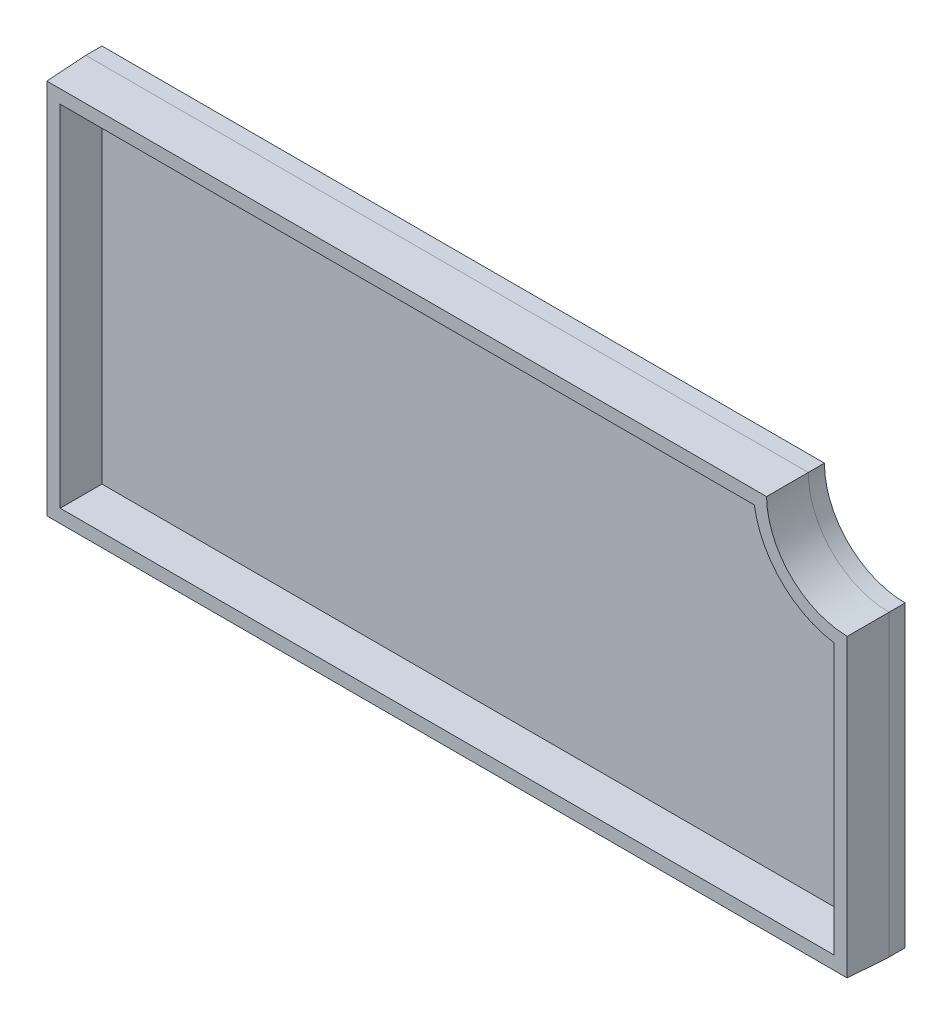
ISO-10303-21;
HEADER;
FILE_DESCRIPTION(('STEP AP214'),'2;1');
FILE_NAME('part.step','',(''),(''),'','','');
FILE_SCHEMA(('AUTOMOTIVE_DESIGN { 1 0 10303 214 1 1 1 1 }'));
ENDSEC;
DATA;
#1=APPLICATION_CONTEXT('core data for automotive mechanical design processes');
#2=APPLICATION_PROTOCOL_DEFINITION('international standard','automotive_design',2000,#1);
#3=PRODUCT_CONTEXT('',#1,'mechanical');
#4=PRODUCT('Part','Part','',(#3));
#5=PRODUCT_RELATED_PRODUCT_CATEGORY('part','',(#4));
#6=PRODUCT_DEFINITION_FORMATION('','',#4);
#7=PRODUCT_DEFINITION_CONTEXT('part definition',#1,'design');
#8=PRODUCT_DEFINITION('design','',#6,#7);
#9=PRODUCT_DEFINITION_SHAPE('','',#8);
#10=(LENGTH_UNIT() NAMED_UNIT(*) SI_UNIT(.MILLI.,.METRE.));
#11=(NAMED_UNIT(*) PLANE_ANGLE_UNIT() SI_UNIT($,.RADIAN.));
#12=(NAMED_UNIT(*) SI_UNIT($,.STERADIAN.) SOLID_ANGLE_UNIT());
#13=UNCERTAINTY_MEASURE_WITH_UNIT(LENGTH_MEASURE(1.E-05),#10,'distance_accuracy_value','');
#14=(GEOMETRIC_REPRESENTATION_CONTEXT(3) GLOBAL_UNCERTAINTY_ASSIGNED_CONTEXT((#13)) GLOBAL_UNIT_ASSIGNED_CONTEXT((#10,
#11,#12)) REPRESENTATION_CONTEXT('',''));
#15=CARTESIAN_POINT('',(0.,0.,0.));
#16=DIRECTION('',(0.,0.,1.));
#17=DIRECTION('',(1.,0.,0.));
#18=AXIS2_PLACEMENT_3D('',#15,#16,#17);
#19=CARTESIAN_POINT('',(0.,0.,2.));
#20=DIRECTION('',(1.,0.,0.));
#21=DIRECTION('',(0.,0.,-1.));
#22=AXIS2_PLACEMENT_3D('',#19,#20,#21);
#23=PLANE('',#22);
#24=DIRECTION('',(0.,-1.,0.));
#25=VECTOR('',#24,1.);
#26=CARTESIAN_POINT('',(0.,0.,0.));
#27=LINE('',#26,#25);
#28=CARTESIAN_POINT('',(0.,47.,0.));
#29=VERTEX_POINT('',#28);
#30=CARTESIAN_POINT('',(0.,0.,0.));
#31=VERTEX_POINT('',#30);
#32=EDGE_CURVE('E165',#29,#31,#27,.T.);
#33=ORIENTED_EDGE('',*,*,#32,.T.);
#34=DIRECTION('',(0.,0.,-1.));
#35=VECTOR('',#34,1.);
#36=CARTESIAN_POINT('',(0.,0.,2.));
#37=LINE('',#36,#35);
#38=CARTESIAN_POINT('',(0.,0.,2.));
#39=VERTEX_POINT('',#38);
#40=EDGE_CURVE('E11',#39,#31,#37,.T.);
#41=ORIENTED_EDGE('',*,*,#40,.F.);
#42=DIRECTION('',(0.,-1.,0.));
#43=VECTOR('',#42,1.);
#44=CARTESIAN_POINT('',(0.,0.,2.));
#45=LINE('',#44,#43);
#46=CARTESIAN_POINT('',(0.,47.,2.));
#47=VERTEX_POINT('',#46);
#48=EDGE_CURVE('E301',#47,#39,#45,.T.);
#49=ORIENTED_EDGE('',*,*,#48,.F.);
#50=DIRECTION('',(0.,0.,-1.));
#51=VECTOR('',#50,1.);
#52=CARTESIAN_POINT('',(0.,47.,2.));
#53=LINE('',#52,#51);
#54=EDGE_CURVE('E302',#47,#29,#53,.T.);
#55=ORIENTED_EDGE('',*,*,#54,.T.);
#56=EDGE_LOOP('',(#33,#41,#49,#55));
#57=FACE_BOUND('',#56,.T.);
#58=ADVANCED_FACE('F39',(#57),#23,.F.);
#59=CARTESIAN_POINT('',(0.,0.,2.));
#60=DIRECTION('',(0.,1.,0.));
#61=DIRECTION('',(0.,0.,1.));
#62=AXIS2_PLACEMENT_3D('',#59,#60,#61);
#63=PLANE('',#62);
#64=DIRECTION('',(1.,0.,0.));
#65=VECTOR('',#64,1.);
#66=CARTESIAN_POINT('',(0.,0.,0.));
#67=LINE('',#66,#65);
#68=CARTESIAN_POINT('',(99.5,0.,0.));
#69=VERTEX_POINT('',#68);
#70=EDGE_CURVE('E273',#31,#69,#67,.T.);
#71=ORIENTED_EDGE('',*,*,#70,.T.);
#72=DIRECTION('',(0.,0.,-1.));
#73=VECTOR('',#72,1.);
#74=CARTESIAN_POINT('',(99.5,0.,2.));
#75=LINE('',#74,#73);
#76=CARTESIAN_POINT('',(99.5,0.,2.));
#77=VERTEX_POINT('',#76);
#78=EDGE_CURVE('E47',#77,#69,#75,.T.);
#79=ORIENTED_EDGE('',*,*,#78,.F.);
#80=DIRECTION('',(1.,0.,0.));
#81=VECTOR('',#80,1.);
#82=CARTESIAN_POINT('',(0.,0.,2.));
#83=LINE('',#82,#81);
#84=EDGE_CURVE('E327',#39,#77,#83,.T.);
#85=ORIENTED_EDGE('',*,*,#84,.F.);
#86=ORIENTED_EDGE('',*,*,#40,.T.);
#87=EDGE_LOOP('',(#71,#79,#85,#86));
#88=FACE_BOUND('',#87,.T.);
#89=ADVANCED_FACE('F265',(#88),#63,.F.);
#90=CARTESIAN_POINT('',(99.5,0.,2.));
#91=DIRECTION('',(-1.,0.,0.));
#92=DIRECTION('',(0.,0.,1.));
#93=AXIS2_PLACEMENT_3D('',#90,#91,#92);
#94=PLANE('',#93);
#95=DIRECTION('',(0.,1.,0.));
#96=VECTOR('',#95,1.);
#97=CARTESIAN_POINT('',(99.5,0.,0.));
#98=LINE('',#97,#96);
#99=CARTESIAN_POINT('',(99.5,37.,0.));
#100=VERTEX_POINT('',#99);
#101=EDGE_CURVE('E281',#69,#100,#98,.T.);
#102=ORIENTED_EDGE('',*,*,#101,.T.);
#103=DIRECTION('',(0.,0.,-1.));
#104=VECTOR('',#103,1.);
#105=CARTESIAN_POINT('',(99.5,37.,2.));
#106=LINE('',#105,#104);
#107=CARTESIAN_POINT('',(99.5,37.,2.));
#108=VERTEX_POINT('',#107);
#109=EDGE_CURVE('E288',#108,#100,#106,.T.);
#110=ORIENTED_EDGE('',*,*,#109,.F.);
#111=DIRECTION('',(0.,1.,0.));
#112=VECTOR('',#111,1.);
#113=CARTESIAN_POINT('',(99.5,0.,2.));
#114=LINE('',#113,#112);
#115=EDGE_CURVE('E285',#77,#108,#114,.T.);
#116=ORIENTED_EDGE('',*,*,#115,.F.);
#117=ORIENTED_EDGE('',*,*,#78,.T.);
#118=EDGE_LOOP('',(#102,#110,#116,#117));
#119=FACE_BOUND('',#118,.T.);
#120=ADVANCED_FACE('F262',(#119),#94,.F.);
#121=CARTESIAN_POINT('',(99.5,47.,2.));
#122=DIRECTION('',(0.,0.,-1.));
#123=DIRECTION('',(-1.,0.,0.));
#124=AXIS2_PLACEMENT_3D('',#121,#122,#123);
#125=CYLINDRICAL_SURFACE('',#124,9.99999999999999);
#126=CARTESIAN_POINT('',(99.5,47.,0.));
#127=DIRECTION('',(0.,0.,-1.));
#128=DIRECTION('',(1.,0.,0.));
#129=AXIS2_PLACEMENT_3D('',#126,#127,#128);
#130=CIRCLE('',#129,9.99999999999999);
#131=CARTESIAN_POINT('',(89.5,47.,0.));
#132=VERTEX_POINT('',#131);
#133=EDGE_CURVE('E291',#100,#132,#130,.T.);
#134=ORIENTED_EDGE('',*,*,#133,.T.);
#135=DIRECTION('',(0.,0.,-1.));
#136=VECTOR('',#135,1.);
#137=CARTESIAN_POINT('',(89.5,47.,2.));
#138=LINE('',#137,#136);
#139=CARTESIAN_POINT('',(89.5,47.,2.));
#140=VERTEX_POINT('',#139);
#141=EDGE_CURVE('E306',#140,#132,#138,.T.);
#142=ORIENTED_EDGE('',*,*,#141,.F.);
#143=CARTESIAN_POINT('',(99.5,47.,2.));
#144=DIRECTION('',(0.,0.,-1.));
#145=DIRECTION('',(1.,0.,0.));
#146=AXIS2_PLACEMENT_3D('',#143,#144,#145);
#147=CIRCLE('',#146,9.99999999999999);
#148=EDGE_CURVE('E315',#108,#140,#147,.T.);
#149=ORIENTED_EDGE('',*,*,#148,.F.);
#150=ORIENTED_EDGE('',*,*,#109,.T.);
#151=EDGE_LOOP('',(#134,#142,#149,#150));
#152=FACE_BOUND('',#151,.T.);
#153=ADVANCED_FACE('F258',(#152),#125,.F.);
#154=CARTESIAN_POINT('',(0.,47.,2.));
#155=DIRECTION('',(0.,-1.,0.));
#156=DIRECTION('',(0.,0.,-1.));
#157=AXIS2_PLACEMENT_3D('',#154,#155,#156);
#158=PLANE('',#157);
#159=DIRECTION('',(-1.,0.,0.));
#160=VECTOR('',#159,1.);
#161=CARTESIAN_POINT('',(0.,47.,0.));
#162=LINE('',#161,#160);
#163=EDGE_CURVE('E295',#132,#29,#162,.T.);
#164=ORIENTED_EDGE('',*,*,#163,.T.);
#165=ORIENTED_EDGE('',*,*,#54,.F.);
#166=DIRECTION('',(-1.,0.,0.));
#167=VECTOR('',#166,1.);
#168=CARTESIAN_POINT('',(0.,47.,2.));
#169=LINE('',#168,#167);
#170=EDGE_CURVE('E307',#140,#47,#169,.T.);
#171=ORIENTED_EDGE('',*,*,#170,.F.);
#172=ORIENTED_EDGE('',*,*,#141,.T.);
#173=EDGE_LOOP('',(#164,#165,#171,#172));
#174=FACE_BOUND('',#173,.T.);
#175=ADVANCED_FACE('F254',(#174),#158,.F.);
#176=CARTESIAN_POINT('',(99.5,47.,0.));
#177=DIRECTION('',(0.,0.,1.));
#178=DIRECTION('',(1.,0.,0.));
#179=AXIS2_PLACEMENT_3D('',#176,#177,#178);
#180=PLANE('',#179);
#181=ORIENTED_EDGE('',*,*,#32,.F.);
#182=ORIENTED_EDGE('',*,*,#163,.F.);
#183=ORIENTED_EDGE('',*,*,#133,.F.);
#184=ORIENTED_EDGE('',*,*,#101,.F.);
#185=ORIENTED_EDGE('',*,*,#70,.F.);
#186=EDGE_LOOP('',(#181,#182,#183,#184,#185));
#187=FACE_BOUND('',#186,.T.);
#188=ADVANCED_FACE('F250',(#187),#180,.F.);
#189=CARTESIAN_POINT('',(99.5,47.,7.));
#190=DIRECTION('',(0.,0.,1.));
#191=DIRECTION('',(1.,0.,0.));
#192=AXIS2_PLACEMENT_3D('',#189,#190,#191);
#193=PLANE('',#192);
#194=DIRECTION('',(1.,0.,0.));
#195=VECTOR('',#194,1.);
#196=CARTESIAN_POINT('',(89.5,46.8253961525413,7.));
#197=LINE('',#196,#195);
#198=CARTESIAN_POINT('',(89.3268944294687,46.8253961525413,7.));
#199=VERTEX_POINT('',#198);
#200=CARTESIAN_POINT('',(0.174603847458739,46.8253961525413,7.));
#201=VERTEX_POINT('',#200);
#202=EDGE_CURVE('E221',#199,#201,#197,.F.);
#203=ORIENTED_EDGE('',*,*,#202,.T.);
#204=DIRECTION('',(0.,1.,0.));
#205=VECTOR('',#204,1.);
#206=CARTESIAN_POINT('',(0.174603847458739,47.,7.));
#207=LINE('',#206,#205);
#208=CARTESIAN_POINT('',(0.174603847458739,0.174603847458739,7.));
#209=VERTEX_POINT('',#208);
#210=EDGE_CURVE('E338',#201,#209,#207,.F.);
#211=ORIENTED_EDGE('',*,*,#210,.T.);
#212=DIRECTION('',(-1.,0.,0.));
#213=VECTOR('',#212,1.);
#214=CARTESIAN_POINT('',(0.,0.174603847458739,7.));
#215=LINE('',#214,#213);
#216=CARTESIAN_POINT('',(99.3253961525413,0.174603847458739,7.));
#217=VERTEX_POINT('',#216);
#218=EDGE_CURVE('E341',#209,#217,#215,.F.);
#219=ORIENTED_EDGE('',*,*,#218,.T.);
#220=DIRECTION('',(0.,-1.,0.));
#221=VECTOR('',#220,1.);
#222=CARTESIAN_POINT('',(99.3253961525413,0.,7.));
#223=LINE('',#222,#221);
#224=CARTESIAN_POINT('',(99.3253961525413,36.8268944294687,7.));
#225=VERTEX_POINT('',#224);
#226=EDGE_CURVE('E343',#217,#225,#223,.F.);
#227=ORIENTED_EDGE('',*,*,#226,.T.);
#228=CARTESIAN_POINT('',(99.5,47.,7.));
#229=DIRECTION('',(0.,0.,1.));
#230=DIRECTION('',(1.,0.,0.));
#231=AXIS2_PLACEMENT_3D('',#228,#229,#230);
#232=CIRCLE('',#231,10.1746038474587);
#233=EDGE_CURVE('E178',#225,#199,#232,.F.);
#234=ORIENTED_EDGE('',*,*,#233,.T.);
#235=EDGE_LOOP('',(#203,#211,#219,#227,#234));
#236=FACE_BOUND('',#235,.T.);
#237=DIRECTION('',(0.,-1.,0.));
#238=VECTOR('',#237,1.);
#239=CARTESIAN_POINT('',(1.82539615254126,45.,7.));
#240=LINE('',#239,#238);
#241=CARTESIAN_POINT('',(1.82539615254126,45.1746038474587,7.));
#242=VERTEX_POINT('',#241);
#243=CARTESIAN_POINT('',(1.82539615254127,1.82539615254126,7.));
#244=VERTEX_POINT('',#243);
#245=EDGE_CURVE('E157',#242,#244,#240,.T.);
#246=ORIENTED_EDGE('',*,*,#245,.F.);
#247=DIRECTION('',(-1.,0.,0.));
#248=VECTOR('',#247,1.);
#249=CARTESIAN_POINT('',(87.6678404338007,45.1746038474587,7.));
#250=LINE('',#249,#248);
#251=CARTESIAN_POINT('',(87.8163394840989,45.1746038474587,7.));
#252=VERTEX_POINT('',#251);
#253=EDGE_CURVE('E154',#252,#242,#250,.T.);
#254=ORIENTED_EDGE('',*,*,#253,.F.);
#255=CARTESIAN_POINT('',(99.5,47.,7.));
#256=DIRECTION('',(0.,0.,1.));
#257=DIRECTION('',(1.,0.,0.));
#258=AXIS2_PLACEMENT_3D('',#255,#256,#257);
#259=CIRCLE('',#258,11.8253961525413);
#260=CARTESIAN_POINT('',(97.6746038474587,35.3163394840989,7.));
#261=VERTEX_POINT('',#260);
#262=EDGE_CURVE('E215',#261,#252,#259,.F.);
#263=ORIENTED_EDGE('',*,*,#262,.F.);
#264=DIRECTION('',(0.,1.,0.));
#265=VECTOR('',#264,1.);
#266=CARTESIAN_POINT('',(97.6746038474587,2.,7.));
#267=LINE('',#266,#265);
#268=CARTESIAN_POINT('',(97.6746038474587,1.82539615254126,7.));
#269=VERTEX_POINT('',#268);
#270=EDGE_CURVE('E143',#269,#261,#267,.T.);
#271=ORIENTED_EDGE('',*,*,#270,.F.);
#272=DIRECTION('',(1.,0.,0.));
#273=VECTOR('',#272,1.);
#274=CARTESIAN_POINT('',(2.00000000000001,1.82539615254126,7.));
#275=LINE('',#274,#273);
#276=EDGE_CURVE('E366',#244,#269,#275,.T.);
#277=ORIENTED_EDGE('',*,*,#276,.F.);
#278=EDGE_LOOP('',(#246,#254,#263,#271,#277));
#279=FACE_BOUND('',#278,.T.);
#280=ADVANCED_FACE('F253',(#236,#279),#193,.T.);
#281=CARTESIAN_POINT('',(89.5,47.,2.));
#282=DIRECTION('',(0.,0.999390827019096,0.034899496702501));
#283=DIRECTION('',(0.,-0.034899496702501,0.999390827019096));
#284=AXIS2_PLACEMENT_3D('',#281,#282,#283);
#285=PLANE('',#284);
#286=ORIENTED_EDGE('',*,*,#170,.T.);
#287=DIRECTION('',(-0.0348782627423747,0.0348782627423747,-0.998782765958718));
#288=VECTOR('',#287,1.);
#289=CARTESIAN_POINT('',(0.,47.,2.));
#290=LINE('',#289,#288);
#291=EDGE_CURVE('E161',#201,#47,#290,.T.);
#292=ORIENTED_EDGE('',*,*,#291,.F.);
#293=ORIENTED_EDGE('',*,*,#202,.F.);
#294=CARTESIAN_POINT('',(89.3268944294687,46.8253961525413,7.));
#295=CARTESIAN_POINT('',(89.3554980884189,46.8544970923625,6.1666581165076));
#296=CARTESIAN_POINT('',(89.3842253821022,46.8835978828919,5.33332050817401));
#297=CARTESIAN_POINT('',(89.4419272389459,46.9417991653782,3.66665384150734));
#298=CARTESIAN_POINT('',(89.4709018021063,46.970899657335,2.83332478317426));
#299=CARTESIAN_POINT('',(89.5,47.,2.));
#300=B_SPLINE_CURVE_WITH_KNOTS('',3,(#294,#295,#296,#297,#298,#299),.UNSPECIFIED.,.F.,.F.,(4,2,
4),(0.,2.5030208041234,5.00604160919931),.UNSPECIFIED.);
#301=EDGE_CURVE('E167',#199,#140,#300,.T.);
#302=ORIENTED_EDGE('',*,*,#301,.T.);
#303=EDGE_LOOP('',(#286,#292,#293,#302));
#304=FACE_BOUND('',#303,.T.);
#305=ADVANCED_FACE('F185',(#304),#285,.T.);
#306=CARTESIAN_POINT('',(0.,47.,2.));
#307=DIRECTION('',(-0.999390827019096,0.,0.034899496702501));
#308=DIRECTION('',(0.034899496702501,0.,0.999390827019096));
#309=AXIS2_PLACEMENT_3D('',#306,#307,#308);
#310=PLANE('',#309);
#311=ORIENTED_EDGE('',*,*,#48,.T.);
#312=DIRECTION('',(-0.0348782627423747,-0.0348782627423747,-0.998782765958718));
#313=VECTOR('',#312,1.);
#314=CARTESIAN_POINT('',(0.,0.,2.));
#315=LINE('',#314,#313);
#316=EDGE_CURVE('E166',#209,#39,#315,.T.);
#317=ORIENTED_EDGE('',*,*,#316,.F.);
#318=ORIENTED_EDGE('',*,*,#210,.F.);
#319=ORIENTED_EDGE('',*,*,#291,.T.);
#320=EDGE_LOOP('',(#311,#317,#318,#319));
#321=FACE_BOUND('',#320,.T.);
#322=ADVANCED_FACE('F237',(#321),#310,.T.);
#323=CARTESIAN_POINT('',(0.,0.,2.));
#324=DIRECTION('',(0.,-0.999390827019096,0.034899496702501));
#325=DIRECTION('',(0.,-0.034899496702501,-0.999390827019096));
#326=AXIS2_PLACEMENT_3D('',#323,#324,#325);
#327=PLANE('',#326);
#328=ORIENTED_EDGE('',*,*,#84,.T.);
#329=DIRECTION('',(0.0348782627423747,-0.0348782627423747,-0.998782765958718));
#330=VECTOR('',#329,1.);
#331=CARTESIAN_POINT('',(99.5,0.,2.));
#332=LINE('',#331,#330);
#333=EDGE_CURVE('E325',#217,#77,#332,.T.);
#334=ORIENTED_EDGE('',*,*,#333,.F.);
#335=ORIENTED_EDGE('',*,*,#218,.F.);
#336=ORIENTED_EDGE('',*,*,#316,.T.);
#337=EDGE_LOOP('',(#328,#334,#335,#336));
#338=FACE_BOUND('',#337,.T.);
#339=ADVANCED_FACE('F198',(#338),#327,.T.);
#340=CARTESIAN_POINT('',(99.5,0.,2.));
#341=DIRECTION('',(0.999390827019096,0.,0.034899496702501));
#342=DIRECTION('',(0.034899496702501,0.,-0.999390827019096));
#343=AXIS2_PLACEMENT_3D('',#340,#341,#342);
#344=PLANE('',#343);
#345=ORIENTED_EDGE('',*,*,#115,.T.);
#346=CARTESIAN_POINT('',(99.3253961525413,36.8268944294687,7.));
#347=CARTESIAN_POINT('',(99.3544970923625,36.8554980884189,6.1666581165076));
#348=CARTESIAN_POINT('',(99.3835978828919,36.8842253821022,5.33332050817401));
#349=CARTESIAN_POINT('',(99.4417991653782,36.9419272389458,3.66665384150734));
#350=CARTESIAN_POINT('',(99.470899657335,36.9709018021063,2.83332478317426));
#351=CARTESIAN_POINT('',(99.5,37.,2.));
#352=B_SPLINE_CURVE_WITH_KNOTS('',3,(#346,#347,#348,#349,#350,#351),.UNSPECIFIED.,.F.,.F.,(4,2,
4),(0.,2.5030208041234,5.00604160919931),.UNSPECIFIED.);
#353=EDGE_CURVE('E177',#225,#108,#352,.T.);
#354=ORIENTED_EDGE('',*,*,#353,.F.);
#355=ORIENTED_EDGE('',*,*,#226,.F.);
#356=ORIENTED_EDGE('',*,*,#333,.T.);
#357=EDGE_LOOP('',(#345,#354,#355,#356));
#358=FACE_BOUND('',#357,.T.);
#359=ADVANCED_FACE('F192',(#358),#344,.T.);
#360=CARTESIAN_POINT('',(99.5,47.,2.));
#361=DIRECTION('',(0.,0.,1.));
#362=DIRECTION('',(1.,0.,0.));
#363=AXIS2_PLACEMENT_3D('',#360,#361,#362);
#364=CONICAL_SURFACE('',#363,9.99999999999999,0.0349065850398866);
#365=ORIENTED_EDGE('',*,*,#148,.T.);
#366=ORIENTED_EDGE('',*,*,#301,.F.);
#367=ORIENTED_EDGE('',*,*,#233,.F.);
#368=ORIENTED_EDGE('',*,*,#353,.T.);
#369=EDGE_LOOP('',(#365,#366,#367,#368));
#370=FACE_BOUND('',#369,.T.);
#371=ADVANCED_FACE('F188',(#370),#364,.F.);
#372=CARTESIAN_POINT('',(87.6678404338007,45.,2.));
#373=DIRECTION('',(0.,-0.999390827019096,0.034899496702501));
#374=DIRECTION('',(0.,-0.034899496702501,-0.999390827019096));
#375=AXIS2_PLACEMENT_3D('',#372,#373,#374);
#376=PLANE('',#375);
#377=DIRECTION('',(-1.,0.,0.));
#378=VECTOR('',#377,1.);
#379=CARTESIAN_POINT('',(87.6678404338007,45.,2.));
#380=LINE('',#379,#378);
#381=CARTESIAN_POINT('',(87.6678404338007,45.,2.));
#382=VERTEX_POINT('',#381);
#383=CARTESIAN_POINT('',(2.,45.,2.));
#384=VERTEX_POINT('',#383);
#385=EDGE_CURVE('E54',#382,#384,#380,.T.);
#386=ORIENTED_EDGE('',*,*,#385,.F.);
#387=CARTESIAN_POINT('',(87.8163394840989,45.1746038474587,7.));
#388=CARTESIAN_POINT('',(87.7914334897459,45.1455033679686,6.16667129866812));
#389=CARTESIAN_POINT('',(87.7666055717104,45.1164028076011,5.33334028130874));
#390=CARTESIAN_POINT('',(87.7171058882777,45.0582015251149,3.66667361464207));
#391=CARTESIAN_POINT('',(87.6924341228805,45.0291008029962,2.83333796533478));
#392=CARTESIAN_POINT('',(87.6678404338007,45.,2.));
#393=B_SPLINE_CURVE_WITH_KNOTS('',3,(#387,#388,#389,#390,#391,#392),.UNSPECIFIED.,.F.,.F.,(4,2,
4),(0.,2.50262555600875,5.0052511116959),.UNSPECIFIED.);
#394=EDGE_CURVE('E148',#252,#382,#393,.T.);
#395=ORIENTED_EDGE('',*,*,#394,.F.);
#396=ORIENTED_EDGE('',*,*,#253,.T.);
#397=DIRECTION('',(0.0348782627423747,-0.0348782627423747,-0.998782765958718));
#398=VECTOR('',#397,1.);
#399=CARTESIAN_POINT('',(2.,45.,2.));
#400=LINE('',#399,#398);
#401=EDGE_CURVE('E217',#242,#384,#400,.T.);
#402=ORIENTED_EDGE('',*,*,#401,.T.);
#403=EDGE_LOOP('',(#386,#395,#396,#402));
#404=FACE_BOUND('',#403,.T.);
#405=ADVANCED_FACE('F191',(#404),#376,.T.);
#406=CARTESIAN_POINT('',(2.,45.,2.));
#407=DIRECTION('',(0.999390827019096,0.,0.034899496702501));
#408=DIRECTION('',(0.034899496702501,0.,-0.999390827019096));
#409=AXIS2_PLACEMENT_3D('',#406,#407,#408);
#410=PLANE('',#409);
#411=DIRECTION('',(0.,-1.,0.));
#412=VECTOR('',#411,1.);
#413=CARTESIAN_POINT('',(2.,45.,2.));
#414=LINE('',#413,#412);
#415=CARTESIAN_POINT('',(2.00000000000003,2.,2.));
#416=VERTEX_POINT('',#415);
#417=EDGE_CURVE('E58',#384,#416,#414,.T.);
#418=ORIENTED_EDGE('',*,*,#417,.F.);
#419=ORIENTED_EDGE('',*,*,#401,.F.);
#420=ORIENTED_EDGE('',*,*,#245,.T.);
#421=DIRECTION('',(0.0348782627423747,0.0348782627423747,-0.998782765958718));
#422=VECTOR('',#421,1.);
#423=CARTESIAN_POINT('',(2.00000000000001,2.,2.));
#424=LINE('',#423,#422);
#425=EDGE_CURVE('E222',#244,#416,#424,.T.);
#426=ORIENTED_EDGE('',*,*,#425,.T.);
#427=EDGE_LOOP('',(#418,#419,#420,#426));
#428=FACE_BOUND('',#427,.T.);
#429=ADVANCED_FACE('F203',(#428),#410,.T.);
#430=CARTESIAN_POINT('',(2.00000000000001,2.,2.));
#431=DIRECTION('',(0.,0.999390827019096,0.034899496702501));
#432=DIRECTION('',(0.,-0.034899496702501,0.999390827019096));
#433=AXIS2_PLACEMENT_3D('',#430,#431,#432);
#434=PLANE('',#433);
#435=DIRECTION('',(1.,0.,0.));
#436=VECTOR('',#435,1.);
#437=CARTESIAN_POINT('',(2.00000000000001,2.,2.));
#438=LINE('',#437,#436);
#439=CARTESIAN_POINT('',(97.5,2.00000000000002,2.));
#440=VERTEX_POINT('',#439);
#441=EDGE_CURVE('E133',#416,#440,#438,.T.);
#442=ORIENTED_EDGE('',*,*,#441,.F.);
#443=ORIENTED_EDGE('',*,*,#425,.F.);
#444=ORIENTED_EDGE('',*,*,#276,.T.);
#445=DIRECTION('',(-0.0348782627423747,0.0348782627423747,-0.998782765958718));
#446=VECTOR('',#445,1.);
#447=CARTESIAN_POINT('',(97.5,2.,2.));
#448=LINE('',#447,#446);
#449=EDGE_CURVE('E147',#269,#440,#448,.T.);
#450=ORIENTED_EDGE('',*,*,#449,.T.);
#451=EDGE_LOOP('',(#442,#443,#444,#450));
#452=FACE_BOUND('',#451,.T.);
#453=ADVANCED_FACE('F234',(#452),#434,.T.);
#454=CARTESIAN_POINT('',(97.5,2.,2.));
#455=DIRECTION('',(-0.999390827019096,0.,0.034899496702501));
#456=DIRECTION('',(0.034899496702501,0.,0.999390827019096));
#457=AXIS2_PLACEMENT_3D('',#454,#455,#456);
#458=PLANE('',#457);
#459=DIRECTION('',(0.,1.,0.));
#460=VECTOR('',#459,1.);
#461=CARTESIAN_POINT('',(97.5,2.,2.));
#462=LINE('',#461,#460);
#463=CARTESIAN_POINT('',(97.5,35.1678404338007,2.));
#464=VERTEX_POINT('',#463);
#465=EDGE_CURVE('E127',#440,#464,#462,.T.);
#466=ORIENTED_EDGE('',*,*,#465,.F.);
#467=ORIENTED_EDGE('',*,*,#449,.F.);
#468=ORIENTED_EDGE('',*,*,#270,.T.);
#469=CARTESIAN_POINT('',(97.6746038474587,35.3163394840989,7.));
#470=CARTESIAN_POINT('',(97.6455033679687,35.2914334897459,6.16667129866812));
#471=CARTESIAN_POINT('',(97.6164028076011,35.2666055717104,5.33334028130874));
#472=CARTESIAN_POINT('',(97.5582015251149,35.2171058882777,3.66667361464207));
#473=CARTESIAN_POINT('',(97.5291008029962,35.1924341228805,2.83333796533478));
#474=CARTESIAN_POINT('',(97.5,35.1678404338007,2.));
#475=B_SPLINE_CURVE_WITH_KNOTS('',3,(#469,#470,#471,#472,#473,#474),.UNSPECIFIED.,.F.,.F.,(4,2,
4),(0.,2.50262555600875,5.0052511116959),.UNSPECIFIED.);
#476=EDGE_CURVE('E140',#261,#464,#475,.T.);
#477=ORIENTED_EDGE('',*,*,#476,.T.);
#478=EDGE_LOOP('',(#466,#467,#468,#477));
#479=FACE_BOUND('',#478,.T.);
#480=ADVANCED_FACE('F141',(#479),#458,.T.);
#481=CARTESIAN_POINT('',(99.5,47.,2.));
#482=DIRECTION('',(0.,0.,-1.));
#483=DIRECTION('',(1.,0.,0.));
#484=AXIS2_PLACEMENT_3D('',#481,#482,#483);
#485=CONICAL_SURFACE('',#484,12.,0.0349065850398866);
#486=CARTESIAN_POINT('',(99.5,47.,2.));
#487=DIRECTION('',(0.,0.,-1.));
#488=DIRECTION('',(1.,0.,0.));
#489=AXIS2_PLACEMENT_3D('',#486,#487,#488);
#490=CIRCLE('',#489,12.);
#491=EDGE_CURVE('E131',#464,#382,#490,.T.);
#492=ORIENTED_EDGE('',*,*,#491,.F.);
#493=ORIENTED_EDGE('',*,*,#476,.F.);
#494=ORIENTED_EDGE('',*,*,#262,.T.);
#495=ORIENTED_EDGE('',*,*,#394,.T.);
#496=EDGE_LOOP('',(#492,#493,#494,#495));
#497=FACE_BOUND('',#496,.T.);
#498=ADVANCED_FACE('F151',(#497),#485,.T.);
#499=CARTESIAN_POINT('',(99.5,47.,2.));
#500=DIRECTION('',(0.,0.,1.));
#501=DIRECTION('',(1.,0.,0.));
#502=AXIS2_PLACEMENT_3D('',#499,#500,#501);
#503=PLANE('',#502);
#504=ORIENTED_EDGE('',*,*,#385,.T.);
#505=ORIENTED_EDGE('',*,*,#417,.T.);
#506=ORIENTED_EDGE('',*,*,#441,.T.);
#507=ORIENTED_EDGE('',*,*,#465,.T.);
#508=ORIENTED_EDGE('',*,*,#491,.T.);
#509=EDGE_LOOP('',(#504,#505,#506,#507,#508));
#510=FACE_BOUND('',#509,.T.);
#511=ADVANCED_FACE('F129',(#510),#503,.T.);
#512=CLOSED_SHELL('',(#58,#89,#120,#153,#175,#188,#280,#305,#322,#339,#359,#371,#405,#429,#453,
#480,#498,#511));
#513=MANIFOLD_SOLID_BREP('B2',#512);
#514=ADVANCED_BREP_SHAPE_REPRESENTATION('',(#18,#513),#14);
#515=SHAPE_DEFINITION_REPRESENTATION(#9,#514);
ENDSEC;
END-ISO-10303-21;
